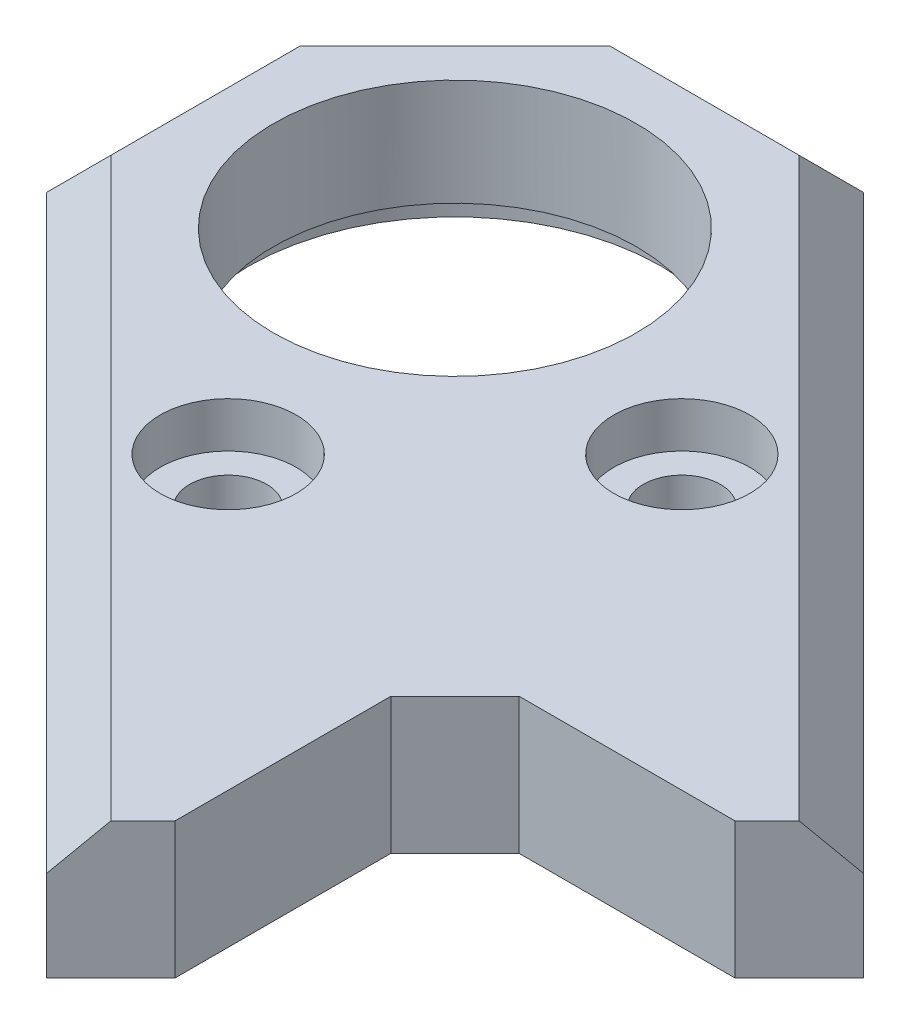
ISO-10303-21;
HEADER;
FILE_DESCRIPTION(('STEP AP214'),'2;1');
FILE_NAME('part.step','',(''),(''),'','','');
FILE_SCHEMA(('AUTOMOTIVE_DESIGN { 1 0 10303 214 1 1 1 1 }'));
ENDSEC;
DATA;
#1=APPLICATION_CONTEXT('core data for automotive mechanical design processes');
#2=APPLICATION_PROTOCOL_DEFINITION('international standard','automotive_design',2000,#1);
#3=PRODUCT_CONTEXT('',#1,'mechanical');
#4=PRODUCT('Part','Part','',(#3));
#5=PRODUCT_RELATED_PRODUCT_CATEGORY('part','',(#4));
#6=PRODUCT_DEFINITION_FORMATION('','',#4);
#7=PRODUCT_DEFINITION_CONTEXT('part definition',#1,'design');
#8=PRODUCT_DEFINITION('design','',#6,#7);
#9=PRODUCT_DEFINITION_SHAPE('','',#8);
#10=(LENGTH_UNIT() NAMED_UNIT(*) SI_UNIT(.MILLI.,.METRE.));
#11=(NAMED_UNIT(*) PLANE_ANGLE_UNIT() SI_UNIT($,.RADIAN.));
#12=(NAMED_UNIT(*) SI_UNIT($,.STERADIAN.) SOLID_ANGLE_UNIT());
#13=UNCERTAINTY_MEASURE_WITH_UNIT(LENGTH_MEASURE(1.E-05),#10,'distance_accuracy_value','');
#14=(GEOMETRIC_REPRESENTATION_CONTEXT(3) GLOBAL_UNCERTAINTY_ASSIGNED_CONTEXT((#13)) GLOBAL_UNIT_ASSIGNED_CONTEXT((#10,
#11,#12)) REPRESENTATION_CONTEXT('',''));
#15=CARTESIAN_POINT('',(0.,0.,0.));
#16=DIRECTION('',(0.,0.,1.));
#17=DIRECTION('',(1.,0.,0.));
#18=AXIS2_PLACEMENT_3D('',#15,#16,#17);
#19=CARTESIAN_POINT('',(-6.,0.,4.));
#20=DIRECTION('',(0.,1.,0.));
#21=DIRECTION('',(0.,0.,1.));
#22=AXIS2_PLACEMENT_3D('',#19,#20,#21);
#23=CYLINDRICAL_SURFACE('',#22,1.7);
#24=CARTESIAN_POINT('',(-6.,0.,4.));
#25=DIRECTION('',(0.,1.,0.));
#26=DIRECTION('',(0.,0.,1.));
#27=AXIS2_PLACEMENT_3D('',#24,#25,#26);
#28=CIRCLE('',#27,1.7);
#29=CARTESIAN_POINT('',(-6.,0.,5.7));
#30=VERTEX_POINT('',#29);
#31=EDGE_CURVE('E187',#30,#30,#28,.T.);
#32=ORIENTED_EDGE('',*,*,#31,.F.);
#33=EDGE_LOOP('',(#32));
#34=FACE_BOUND('',#33,.T.);
#35=CARTESIAN_POINT('',(-6.,4.,4.));
#36=DIRECTION('',(0.,1.,0.));
#37=DIRECTION('',(0.,0.,1.));
#38=AXIS2_PLACEMENT_3D('',#35,#36,#37);
#39=CIRCLE('',#38,1.7);
#40=CARTESIAN_POINT('',(-6.,4.,5.7));
#41=VERTEX_POINT('',#40);
#42=EDGE_CURVE('E183',#41,#41,#39,.F.);
#43=ORIENTED_EDGE('',*,*,#42,.F.);
#44=EDGE_LOOP('',(#43));
#45=FACE_BOUND('',#44,.T.);
#46=ADVANCED_FACE('F41',(#34,#45),#23,.F.);
#47=CARTESIAN_POINT('',(4.,0.,-6.));
#48=DIRECTION('',(0.,1.,0.));
#49=DIRECTION('',(0.,0.,1.));
#50=AXIS2_PLACEMENT_3D('',#47,#48,#49);
#51=CYLINDRICAL_SURFACE('',#50,1.7);
#52=CARTESIAN_POINT('',(4.,0.,-6.));
#53=DIRECTION('',(0.,1.,0.));
#54=DIRECTION('',(0.,0.,1.));
#55=AXIS2_PLACEMENT_3D('',#52,#53,#54);
#56=CIRCLE('',#55,1.7);
#57=CARTESIAN_POINT('',(4.,0.,-4.3));
#58=VERTEX_POINT('',#57);
#59=EDGE_CURVE('E235',#58,#58,#56,.T.);
#60=ORIENTED_EDGE('',*,*,#59,.F.);
#61=EDGE_LOOP('',(#60));
#62=FACE_BOUND('',#61,.T.);
#63=CARTESIAN_POINT('',(4.,4.,-6.));
#64=DIRECTION('',(0.,1.,0.));
#65=DIRECTION('',(0.,0.,1.));
#66=AXIS2_PLACEMENT_3D('',#63,#64,#65);
#67=CIRCLE('',#66,1.7);
#68=CARTESIAN_POINT('',(4.,4.,-4.3));
#69=VERTEX_POINT('',#68);
#70=EDGE_CURVE('E180',#69,#69,#67,.F.);
#71=ORIENTED_EDGE('',*,*,#70,.F.);
#72=EDGE_LOOP('',(#71));
#73=FACE_BOUND('',#72,.T.);
#74=ADVANCED_FACE('F303',(#62,#73),#51,.F.);
#75=CARTESIAN_POINT('',(22.,6.,4.00000000000001));
#76=DIRECTION('',(-0.707106781186546,0.,-0.707106781186549));
#77=DIRECTION('',(0.,-1.,0.));
#78=AXIS2_PLACEMENT_3D('',#75,#76,#77);
#79=PLANE('',#78);
#80=DIRECTION('',(-0.707106781186549,0.,0.707106781186546));
#81=VECTOR('',#80,1.);
#82=CARTESIAN_POINT('',(13.,6.,13.));
#83=LINE('',#82,#81);
#84=CARTESIAN_POINT('',(5.41421356237307,6.,20.5857864376269));
#85=VERTEX_POINT('',#84);
#86=CARTESIAN_POINT('',(6.82842712474616,6.,19.1715728752538));
#87=VERTEX_POINT('',#86);
#88=EDGE_CURVE('E173',#85,#87,#83,.F.);
#89=ORIENTED_EDGE('',*,*,#88,.F.);
#90=DIRECTION('',(0.500000000000002,0.707106781186546,-0.5));
#91=VECTOR('',#90,1.);
#92=CARTESIAN_POINT('',(13.7071067811866,17.7279220613578,12.2928932188134));
#93=LINE('',#92,#91);
#94=CARTESIAN_POINT('',(3.99999999999995,4.00000000000001,22.));
#95=VERTEX_POINT('',#94);
#96=EDGE_CURVE('E11',#85,#95,#93,.F.);
#97=ORIENTED_EDGE('',*,*,#96,.T.);
#98=DIRECTION('',(0.,1.,0.));
#99=VECTOR('',#98,1.);
#100=CARTESIAN_POINT('',(3.99999999999995,6.,22.));
#101=LINE('',#100,#99);
#102=CARTESIAN_POINT('',(3.99999999999995,0.,22.));
#103=VERTEX_POINT('',#102);
#104=EDGE_CURVE('E170',#103,#95,#101,.T.);
#105=ORIENTED_EDGE('',*,*,#104,.F.);
#106=DIRECTION('',(0.707106781186549,0.,-0.707106781186546));
#107=VECTOR('',#106,1.);
#108=CARTESIAN_POINT('',(22.,0.,4.00000000000001));
#109=LINE('',#108,#107);
#110=CARTESIAN_POINT('',(6.82842712474616,0.,19.1715728752538));
#111=VERTEX_POINT('',#110);
#112=EDGE_CURVE('E152',#111,#103,#109,.F.);
#113=ORIENTED_EDGE('',*,*,#112,.F.);
#114=DIRECTION('',(0.,1.,0.));
#115=VECTOR('',#114,1.);
#116=CARTESIAN_POINT('',(6.82842712474616,0.,19.1715728752538));
#117=LINE('',#116,#115);
#118=EDGE_CURVE('E238',#111,#87,#117,.T.);
#119=ORIENTED_EDGE('',*,*,#118,.T.);
#120=EDGE_LOOP('',(#89,#97,#105,#113,#119));
#121=FACE_BOUND('',#120,.T.);
#122=ADVANCED_FACE('F309',(#121),#79,.F.);
#123=CARTESIAN_POINT('',(-9.6298339959391,0.,-9.62499999999999));
#124=DIRECTION('',(0.,1.,0.));
#125=DIRECTION('',(0.,0.,1.));
#126=AXIS2_PLACEMENT_3D('',#123,#124,#125);
#127=CYLINDRICAL_SURFACE('',#126,8.);
#128=CARTESIAN_POINT('',(-9.6298339959391,6.,-9.62499999999999));
#129=DIRECTION('',(0.,1.,0.));
#130=DIRECTION('',(0.,0.,1.));
#131=AXIS2_PLACEMENT_3D('',#128,#129,#130);
#132=CIRCLE('',#131,8.);
#133=CARTESIAN_POINT('',(-9.6298339959391,6.,-1.62499999999999));
#134=VERTEX_POINT('',#133);
#135=EDGE_CURVE('E163',#134,#134,#132,.T.);
#136=ORIENTED_EDGE('',*,*,#135,.T.);
#137=EDGE_LOOP('',(#136));
#138=FACE_BOUND('',#137,.T.);
#139=CARTESIAN_POINT('',(-9.6298339959391,1.3,-9.62499999999999));
#140=DIRECTION('',(0.,-1.,0.));
#141=DIRECTION('',(0.,0.,-1.));
#142=AXIS2_PLACEMENT_3D('',#139,#140,#141);
#143=CIRCLE('',#142,8.);
#144=CARTESIAN_POINT('',(-9.6298339959391,1.3,-17.625));
#145=VERTEX_POINT('',#144);
#146=EDGE_CURVE('E176',#145,#145,#143,.F.);
#147=ORIENTED_EDGE('',*,*,#146,.F.);
#148=EDGE_LOOP('',(#147));
#149=FACE_BOUND('',#148,.T.);
#150=ADVANCED_FACE('F283',(#138,#149),#127,.F.);
#151=CARTESIAN_POINT('',(-22.,6.,-22.));
#152=DIRECTION('',(0.,0.,1.));
#153=DIRECTION('',(1.,0.,0.));
#154=AXIS2_PLACEMENT_3D('',#151,#152,#153);
#155=PLANE('',#154);
#156=DIRECTION('',(0.,1.,0.));
#157=VECTOR('',#156,1.);
#158=CARTESIAN_POINT('',(-14.,0.,-22.));
#159=LINE('',#158,#157);
#160=CARTESIAN_POINT('',(-14.,0.,-22.));
#161=VERTEX_POINT('',#160);
#162=CARTESIAN_POINT('',(-14.,4.00000000000001,-22.));
#163=VERTEX_POINT('',#162);
#164=EDGE_CURVE('E272',#161,#163,#159,.T.);
#165=ORIENTED_EDGE('',*,*,#164,.T.);
#166=DIRECTION('',(1.,0.,0.));
#167=VECTOR('',#166,1.);
#168=CARTESIAN_POINT('',(-4.,4.00000000000001,-22.));
#169=LINE('',#168,#167);
#170=CARTESIAN_POINT('',(-4.,4.00000000000001,-22.));
#171=VERTEX_POINT('',#170);
#172=EDGE_CURVE('E202',#163,#171,#169,.T.);
#173=ORIENTED_EDGE('',*,*,#172,.T.);
#174=DIRECTION('',(0.,1.,0.));
#175=VECTOR('',#174,1.);
#176=CARTESIAN_POINT('',(-4.,0.,-22.));
#177=LINE('',#176,#175);
#178=CARTESIAN_POINT('',(-4.,0.,-22.));
#179=VERTEX_POINT('',#178);
#180=EDGE_CURVE('E267',#179,#171,#177,.T.);
#181=ORIENTED_EDGE('',*,*,#180,.F.);
#182=DIRECTION('',(-1.,0.,0.));
#183=VECTOR('',#182,1.);
#184=CARTESIAN_POINT('',(-22.,0.,-22.));
#185=LINE('',#184,#183);
#186=EDGE_CURVE('E160',#179,#161,#185,.T.);
#187=ORIENTED_EDGE('',*,*,#186,.T.);
#188=EDGE_LOOP('',(#165,#173,#181,#187));
#189=FACE_BOUND('',#188,.T.);
#190=ADVANCED_FACE('F297',(#189),#155,.F.);
#191=CARTESIAN_POINT('',(-22.,6.,-22.));
#192=DIRECTION('',(1.,0.,0.));
#193=DIRECTION('',(0.,0.,-1.));
#194=AXIS2_PLACEMENT_3D('',#191,#192,#193);
#195=PLANE('',#194);
#196=DIRECTION('',(0.,1.,0.));
#197=VECTOR('',#196,1.);
#198=CARTESIAN_POINT('',(-22.,0.,-4.));
#199=LINE('',#198,#197);
#200=CARTESIAN_POINT('',(-22.,0.,-4.));
#201=VERTEX_POINT('',#200);
#202=CARTESIAN_POINT('',(-22.,4.00000000000001,-4.));
#203=VERTEX_POINT('',#202);
#204=EDGE_CURVE('E135',#201,#203,#199,.T.);
#205=ORIENTED_EDGE('',*,*,#204,.T.);
#206=DIRECTION('',(0.,0.,-1.));
#207=VECTOR('',#206,1.);
#208=CARTESIAN_POINT('',(-22.,4.00000000000001,-14.));
#209=LINE('',#208,#207);
#210=CARTESIAN_POINT('',(-22.,4.00000000000001,-14.));
#211=VERTEX_POINT('',#210);
#212=EDGE_CURVE('E206',#203,#211,#209,.T.);
#213=ORIENTED_EDGE('',*,*,#212,.T.);
#214=DIRECTION('',(0.,1.,0.));
#215=VECTOR('',#214,1.);
#216=CARTESIAN_POINT('',(-22.,0.,-14.));
#217=LINE('',#216,#215);
#218=CARTESIAN_POINT('',(-22.,0.,-14.));
#219=VERTEX_POINT('',#218);
#220=EDGE_CURVE('E158',#219,#211,#217,.T.);
#221=ORIENTED_EDGE('',*,*,#220,.F.);
#222=DIRECTION('',(0.,0.,1.));
#223=VECTOR('',#222,1.);
#224=CARTESIAN_POINT('',(-22.,0.,-22.));
#225=LINE('',#224,#223);
#226=EDGE_CURVE('E149',#219,#201,#225,.T.);
#227=ORIENTED_EDGE('',*,*,#226,.T.);
#228=EDGE_LOOP('',(#205,#213,#221,#227));
#229=FACE_BOUND('',#228,.T.);
#230=ADVANCED_FACE('F156',(#229),#195,.F.);
#231=CARTESIAN_POINT('',(0.,6.,0.));
#232=DIRECTION('',(0.,1.,0.));
#233=DIRECTION('',(0.,0.,1.));
#234=AXIS2_PLACEMENT_3D('',#231,#232,#233);
#235=PLANE('',#234);
#236=CARTESIAN_POINT('',(4.,6.,-6.));
#237=DIRECTION('',(0.,1.,0.));
#238=DIRECTION('',(0.,0.,1.));
#239=AXIS2_PLACEMENT_3D('',#236,#237,#238);
#240=CIRCLE('',#239,3.);
#241=CARTESIAN_POINT('',(4.,6.,-3.));
#242=VERTEX_POINT('',#241);
#243=EDGE_CURVE('E231',#242,#242,#240,.T.);
#244=ORIENTED_EDGE('',*,*,#243,.F.);
#245=EDGE_LOOP('',(#244));
#246=FACE_BOUND('',#245,.T.);
#247=CARTESIAN_POINT('',(-6.,6.,4.));
#248=DIRECTION('',(0.,1.,0.));
#249=DIRECTION('',(0.,0.,1.));
#250=AXIS2_PLACEMENT_3D('',#247,#248,#249);
#251=CIRCLE('',#250,3.);
#252=CARTESIAN_POINT('',(-6.,6.,7.));
#253=VERTEX_POINT('',#252);
#254=EDGE_CURVE('E226',#253,#253,#251,.T.);
#255=ORIENTED_EDGE('',*,*,#254,.F.);
#256=EDGE_LOOP('',(#255));
#257=FACE_BOUND('',#256,.T.);
#258=CARTESIAN_POINT('',(19.1715728752538,6.,6.82842712474616));
#259=VERTEX_POINT('',#258);
#260=CARTESIAN_POINT('',(20.5857864376269,6.,5.4142135623731));
#261=VERTEX_POINT('',#260);
#262=EDGE_CURVE('E172',#259,#261,#83,.F.);
#263=ORIENTED_EDGE('',*,*,#262,.T.);
#264=DIRECTION('',(-0.707106781186548,0.,-0.707106781186548));
#265=VECTOR('',#264,1.);
#266=CARTESIAN_POINT('',(-5.4142135623731,6.,-20.5857864376269));
#267=LINE('',#266,#265);
#268=CARTESIAN_POINT('',(-4.82842712474619,6.,-20.));
#269=VERTEX_POINT('',#268);
#270=EDGE_CURVE('E200',#261,#269,#267,.T.);
#271=ORIENTED_EDGE('',*,*,#270,.T.);
#272=DIRECTION('',(-1.,0.,0.));
#273=VECTOR('',#272,1.);
#274=CARTESIAN_POINT('',(-14.,6.,-20.));
#275=LINE('',#274,#273);
#276=CARTESIAN_POINT('',(-13.1715728752538,6.,-20.));
#277=VERTEX_POINT('',#276);
#278=EDGE_CURVE('E198',#269,#277,#275,.T.);
#279=ORIENTED_EDGE('',*,*,#278,.T.);
#280=DIRECTION('',(-0.707106781186548,0.,0.707106781186548));
#281=VECTOR('',#280,1.);
#282=CARTESIAN_POINT('',(-20.5857864376269,6.,-12.5857864376269));
#283=LINE('',#282,#281);
#284=CARTESIAN_POINT('',(-20.,6.,-13.1715728752538));
#285=VERTEX_POINT('',#284);
#286=EDGE_CURVE('E196',#277,#285,#283,.T.);
#287=ORIENTED_EDGE('',*,*,#286,.T.);
#288=DIRECTION('',(0.,0.,1.));
#289=VECTOR('',#288,1.);
#290=CARTESIAN_POINT('',(-20.,6.,-4.));
#291=LINE('',#290,#289);
#292=CARTESIAN_POINT('',(-20.,6.,-4.82842712474619));
#293=VERTEX_POINT('',#292);
#294=EDGE_CURVE('E194',#285,#293,#291,.T.);
#295=ORIENTED_EDGE('',*,*,#294,.T.);
#296=DIRECTION('',(0.707106781186548,0.,0.707106781186547));
#297=VECTOR('',#296,1.);
#298=CARTESIAN_POINT('',(5.4142135623731,6.,20.5857864376269));
#299=LINE('',#298,#297);
#300=EDGE_CURVE('E192',#293,#85,#299,.T.);
#301=ORIENTED_EDGE('',*,*,#300,.T.);
#302=ORIENTED_EDGE('',*,*,#88,.T.);
#303=DIRECTION('',(0.,0.,1.));
#304=VECTOR('',#303,1.);
#305=CARTESIAN_POINT('',(6.82842712474616,6.,9.65685424949236));
#306=LINE('',#305,#304);
#307=CARTESIAN_POINT('',(6.82842712474616,6.,9.65685424949236));
#308=VERTEX_POINT('',#307);
#309=EDGE_CURVE('E250',#308,#87,#306,.T.);
#310=ORIENTED_EDGE('',*,*,#309,.F.);
#311=DIRECTION('',(-0.707106781186548,0.,0.707106781186547));
#312=VECTOR('',#311,1.);
#313=CARTESIAN_POINT('',(9.65685424949236,6.,6.82842712474617));
#314=LINE('',#313,#312);
#315=CARTESIAN_POINT('',(9.65685424949236,6.,6.82842712474617));
#316=VERTEX_POINT('',#315);
#317=EDGE_CURVE('E253',#316,#308,#314,.T.);
#318=ORIENTED_EDGE('',*,*,#317,.F.);
#319=DIRECTION('',(-1.,0.,0.));
#320=VECTOR('',#319,1.);
#321=CARTESIAN_POINT('',(19.1715728752538,6.,6.82842712474616));
#322=LINE('',#321,#320);
#323=EDGE_CURVE('E143',#259,#316,#322,.T.);
#324=ORIENTED_EDGE('',*,*,#323,.F.);
#325=EDGE_LOOP('',(#263,#271,#279,#287,#295,#301,#302,#310,#318,#324));
#326=FACE_BOUND('',#325,.T.);
#327=ORIENTED_EDGE('',*,*,#135,.F.);
#328=EDGE_LOOP('',(#327));
#329=FACE_BOUND('',#328,.T.);
#330=ADVANCED_FACE('F286',(#246,#257,#326,#329),#235,.T.);
#331=CARTESIAN_POINT('',(0.,0.,0.));
#332=DIRECTION('',(0.,1.,0.));
#333=DIRECTION('',(0.,0.,1.));
#334=AXIS2_PLACEMENT_3D('',#331,#332,#333);
#335=PLANE('',#334);
#336=ORIENTED_EDGE('',*,*,#59,.T.);
#337=EDGE_LOOP('',(#336));
#338=FACE_BOUND('',#337,.T.);
#339=ORIENTED_EDGE('',*,*,#31,.T.);
#340=EDGE_LOOP('',(#339));
#341=FACE_BOUND('',#340,.T.);
#342=CARTESIAN_POINT('',(-9.6298339959391,0.,-9.62499999999999));
#343=DIRECTION('',(0.,-1.,0.));
#344=DIRECTION('',(0.,0.,-1.));
#345=AXIS2_PLACEMENT_3D('',#342,#343,#344);
#346=CIRCLE('',#345,9.1);
#347=CARTESIAN_POINT('',(-9.6298339959391,0.,-18.725));
#348=VERTEX_POINT('',#347);
#349=EDGE_CURVE('E275',#348,#348,#346,.T.);
#350=ORIENTED_EDGE('',*,*,#349,.F.);
#351=EDGE_LOOP('',(#350));
#352=FACE_BOUND('',#351,.T.);
#353=ORIENTED_EDGE('',*,*,#112,.T.);
#354=DIRECTION('',(-0.707106781186548,0.,-0.707106781186547));
#355=VECTOR('',#354,1.);
#356=CARTESIAN_POINT('',(-22.,0.,-4.));
#357=LINE('',#356,#355);
#358=EDGE_CURVE('E138',#103,#201,#357,.T.);
#359=ORIENTED_EDGE('',*,*,#358,.T.);
#360=ORIENTED_EDGE('',*,*,#226,.F.);
#361=DIRECTION('',(0.707106781186548,0.,-0.707106781186548));
#362=VECTOR('',#361,1.);
#363=CARTESIAN_POINT('',(-14.,0.,-22.));
#364=LINE('',#363,#362);
#365=EDGE_CURVE('E270',#219,#161,#364,.T.);
#366=ORIENTED_EDGE('',*,*,#365,.T.);
#367=ORIENTED_EDGE('',*,*,#186,.F.);
#368=DIRECTION('',(0.707106781186547,0.,0.707106781186547));
#369=VECTOR('',#368,1.);
#370=CARTESIAN_POINT('',(-4.,0.,-22.));
#371=LINE('',#370,#369);
#372=CARTESIAN_POINT('',(22.,0.,4.));
#373=VERTEX_POINT('',#372);
#374=EDGE_CURVE('E153',#179,#373,#371,.T.);
#375=ORIENTED_EDGE('',*,*,#374,.T.);
#376=CARTESIAN_POINT('',(19.1715728752538,0.,6.82842712474622));
#377=VERTEX_POINT('',#376);
#378=EDGE_CURVE('E167',#373,#377,#109,.F.);
#379=ORIENTED_EDGE('',*,*,#378,.T.);
#380=DIRECTION('',(-1.,0.,0.));
#381=VECTOR('',#380,1.);
#382=CARTESIAN_POINT('',(19.1715728752538,0.,6.82842712474616));
#383=LINE('',#382,#381);
#384=CARTESIAN_POINT('',(9.65685424949236,0.,6.82842712474617));
#385=VERTEX_POINT('',#384);
#386=EDGE_CURVE('E254',#377,#385,#383,.T.);
#387=ORIENTED_EDGE('',*,*,#386,.T.);
#388=DIRECTION('',(-0.707106781186548,0.,0.707106781186547));
#389=VECTOR('',#388,1.);
#390=CARTESIAN_POINT('',(9.65685424949236,0.,6.82842712474617));
#391=LINE('',#390,#389);
#392=CARTESIAN_POINT('',(6.82842712474616,0.,9.65685424949236));
#393=VERTEX_POINT('',#392);
#394=EDGE_CURVE('E260',#385,#393,#391,.T.);
#395=ORIENTED_EDGE('',*,*,#394,.T.);
#396=DIRECTION('',(0.,0.,1.));
#397=VECTOR('',#396,1.);
#398=CARTESIAN_POINT('',(6.82842712474616,0.,9.65685424949236));
#399=LINE('',#398,#397);
#400=EDGE_CURVE('E243',#393,#111,#399,.T.);
#401=ORIENTED_EDGE('',*,*,#400,.T.);
#402=EDGE_LOOP('',(#353,#359,#360,#366,#367,#375,#379,#387,#395,#401));
#403=FACE_BOUND('',#402,.T.);
#404=ADVANCED_FACE('F147',(#338,#341,#352,#403),#335,.F.);
#405=DIRECTION('',(0.,-1.,0.));
#406=VECTOR('',#405,1.);
#407=CARTESIAN_POINT('',(22.,6.,4.00000000000001));
#408=LINE('',#407,#406);
#409=CARTESIAN_POINT('',(22.,4.00000000000001,4.00000000000001));
#410=VERTEX_POINT('',#409);
#411=EDGE_CURVE('E159',#410,#373,#408,.T.);
#412=ORIENTED_EDGE('',*,*,#411,.F.);
#413=DIRECTION('',(0.500000000000002,-0.707106781186546,-0.5));
#414=VECTOR('',#413,1.);
#415=CARTESIAN_POINT('',(21.2928932188135,5.,4.70710678118655));
#416=LINE('',#415,#414);
#417=EDGE_CURVE('E190',#410,#261,#416,.F.);
#418=ORIENTED_EDGE('',*,*,#417,.T.);
#419=ORIENTED_EDGE('',*,*,#262,.F.);
#420=DIRECTION('',(0.,1.,0.));
#421=VECTOR('',#420,1.);
#422=CARTESIAN_POINT('',(19.1715728752538,0.,6.82842712474616));
#423=LINE('',#422,#421);
#424=EDGE_CURVE('E241',#377,#259,#423,.T.);
#425=ORIENTED_EDGE('',*,*,#424,.F.);
#426=ORIENTED_EDGE('',*,*,#378,.F.);
#427=EDGE_LOOP('',(#412,#418,#419,#425,#426));
#428=FACE_BOUND('',#427,.T.);
#429=ADVANCED_FACE('F294',(#428),#79,.F.);
#430=CARTESIAN_POINT('',(-9.6298339959391,1.3,-9.62499999999999));
#431=DIRECTION('',(0.,-1.,0.));
#432=DIRECTION('',(0.,0.,-1.));
#433=AXIS2_PLACEMENT_3D('',#430,#431,#432);
#434=PLANE('',#433);
#435=CARTESIAN_POINT('',(-9.6298339959391,1.3,-9.62499999999999));
#436=DIRECTION('',(0.,-1.,0.));
#437=DIRECTION('',(0.,0.,-1.));
#438=AXIS2_PLACEMENT_3D('',#435,#436,#437);
#439=CIRCLE('',#438,9.1);
#440=CARTESIAN_POINT('',(-9.6298339959391,1.3,-18.725));
#441=VERTEX_POINT('',#440);
#442=EDGE_CURVE('E179',#441,#441,#439,.T.);
#443=ORIENTED_EDGE('',*,*,#442,.T.);
#444=EDGE_LOOP('',(#443));
#445=FACE_BOUND('',#444,.T.);
#446=ORIENTED_EDGE('',*,*,#146,.T.);
#447=EDGE_LOOP('',(#446));
#448=FACE_BOUND('',#447,.T.);
#449=ADVANCED_FACE('F340',(#445,#448),#434,.T.);
#450=CARTESIAN_POINT('',(-9.6298339959391,1.3,-9.62499999999999));
#451=DIRECTION('',(0.,-1.,0.));
#452=DIRECTION('',(0.,0.,-1.));
#453=AXIS2_PLACEMENT_3D('',#450,#451,#452);
#454=CYLINDRICAL_SURFACE('',#453,9.1);
#455=ORIENTED_EDGE('',*,*,#442,.F.);
#456=EDGE_LOOP('',(#455));
#457=FACE_BOUND('',#456,.T.);
#458=ORIENTED_EDGE('',*,*,#349,.T.);
#459=EDGE_LOOP('',(#458));
#460=FACE_BOUND('',#459,.T.);
#461=ADVANCED_FACE('F338',(#457,#460),#454,.F.);
#462=CARTESIAN_POINT('',(-14.,0.,-22.));
#463=DIRECTION('',(0.707106781186547,0.,0.707106781186547));
#464=DIRECTION('',(0.707106781186548,0.,-0.707106781186548));
#465=AXIS2_PLACEMENT_3D('',#462,#463,#464);
#466=PLANE('',#465);
#467=ORIENTED_EDGE('',*,*,#220,.T.);
#468=DIRECTION('',(0.707106781186548,0.,-0.707106781186548));
#469=VECTOR('',#468,1.);
#470=CARTESIAN_POINT('',(-14.,4.00000000000001,-22.));
#471=LINE('',#470,#469);
#472=EDGE_CURVE('E204',#211,#163,#471,.T.);
#473=ORIENTED_EDGE('',*,*,#472,.T.);
#474=ORIENTED_EDGE('',*,*,#164,.F.);
#475=ORIENTED_EDGE('',*,*,#365,.F.);
#476=EDGE_LOOP('',(#467,#473,#474,#475));
#477=FACE_BOUND('',#476,.T.);
#478=ADVANCED_FACE('F334',(#477),#466,.F.);
#479=CARTESIAN_POINT('',(-4.,0.,-22.));
#480=DIRECTION('',(-0.707106781186548,0.,0.707106781186548));
#481=DIRECTION('',(0.707106781186548,0.,0.707106781186548));
#482=AXIS2_PLACEMENT_3D('',#479,#480,#481);
#483=PLANE('',#482);
#484=ORIENTED_EDGE('',*,*,#180,.T.);
#485=DIRECTION('',(0.707106781186548,0.,0.707106781186548));
#486=VECTOR('',#485,1.);
#487=CARTESIAN_POINT('',(22.,4.00000000000001,4.00000000000001));
#488=LINE('',#487,#486);
#489=EDGE_CURVE('E175',#171,#410,#488,.T.);
#490=ORIENTED_EDGE('',*,*,#489,.T.);
#491=ORIENTED_EDGE('',*,*,#411,.T.);
#492=ORIENTED_EDGE('',*,*,#374,.F.);
#493=EDGE_LOOP('',(#484,#490,#491,#492));
#494=FACE_BOUND('',#493,.T.);
#495=ADVANCED_FACE('F330',(#494),#483,.F.);
#496=CARTESIAN_POINT('',(6.82842712474616,0.,9.65685424949236));
#497=DIRECTION('',(-1.,0.,0.));
#498=DIRECTION('',(0.,0.,1.));
#499=AXIS2_PLACEMENT_3D('',#496,#497,#498);
#500=PLANE('',#499);
#501=ORIENTED_EDGE('',*,*,#309,.T.);
#502=ORIENTED_EDGE('',*,*,#118,.F.);
#503=ORIENTED_EDGE('',*,*,#400,.F.);
#504=DIRECTION('',(0.,1.,0.));
#505=VECTOR('',#504,1.);
#506=CARTESIAN_POINT('',(6.82842712474616,0.,9.65685424949236));
#507=LINE('',#506,#505);
#508=EDGE_CURVE('E246',#393,#308,#507,.T.);
#509=ORIENTED_EDGE('',*,*,#508,.T.);
#510=EDGE_LOOP('',(#501,#502,#503,#509));
#511=FACE_BOUND('',#510,.T.);
#512=ADVANCED_FACE('F326',(#511),#500,.F.);
#513=CARTESIAN_POINT('',(9.65685424949236,0.,6.82842712474617));
#514=DIRECTION('',(-0.707106781186547,0.,-0.707106781186548));
#515=DIRECTION('',(-0.707106781186548,0.,0.707106781186547));
#516=AXIS2_PLACEMENT_3D('',#513,#514,#515);
#517=PLANE('',#516);
#518=ORIENTED_EDGE('',*,*,#317,.T.);
#519=ORIENTED_EDGE('',*,*,#508,.F.);
#520=ORIENTED_EDGE('',*,*,#394,.F.);
#521=DIRECTION('',(0.,1.,0.));
#522=VECTOR('',#521,1.);
#523=CARTESIAN_POINT('',(9.65685424949236,0.,6.82842712474617));
#524=LINE('',#523,#522);
#525=EDGE_CURVE('E244',#385,#316,#524,.T.);
#526=ORIENTED_EDGE('',*,*,#525,.T.);
#527=EDGE_LOOP('',(#518,#519,#520,#526));
#528=FACE_BOUND('',#527,.T.);
#529=ADVANCED_FACE('F322',(#528),#517,.F.);
#530=CARTESIAN_POINT('',(19.1715728752538,0.,6.82842712474616));
#531=DIRECTION('',(0.,0.,-1.));
#532=DIRECTION('',(-1.,0.,0.));
#533=AXIS2_PLACEMENT_3D('',#530,#531,#532);
#534=PLANE('',#533);
#535=ORIENTED_EDGE('',*,*,#323,.T.);
#536=ORIENTED_EDGE('',*,*,#525,.F.);
#537=ORIENTED_EDGE('',*,*,#386,.F.);
#538=ORIENTED_EDGE('',*,*,#424,.T.);
#539=EDGE_LOOP('',(#535,#536,#537,#538));
#540=FACE_BOUND('',#539,.T.);
#541=ADVANCED_FACE('F319',(#540),#534,.F.);
#542=CARTESIAN_POINT('',(-22.,0.,-4.));
#543=DIRECTION('',(0.707106781186547,0.,-0.707106781186548));
#544=DIRECTION('',(-0.707106781186548,0.,-0.707106781186547));
#545=AXIS2_PLACEMENT_3D('',#542,#543,#544);
#546=PLANE('',#545);
#547=ORIENTED_EDGE('',*,*,#104,.T.);
#548=DIRECTION('',(-0.707106781186548,0.,-0.707106781186547));
#549=VECTOR('',#548,1.);
#550=CARTESIAN_POINT('',(-22.,4.00000000000001,-4.));
#551=LINE('',#550,#549);
#552=EDGE_CURVE('E51',#95,#203,#551,.T.);
#553=ORIENTED_EDGE('',*,*,#552,.T.);
#554=ORIENTED_EDGE('',*,*,#204,.F.);
#555=ORIENTED_EDGE('',*,*,#358,.F.);
#556=EDGE_LOOP('',(#547,#553,#554,#555));
#557=FACE_BOUND('',#556,.T.);
#558=ADVANCED_FACE('F137',(#557),#546,.F.);
#559=CARTESIAN_POINT('',(4.,4.,-6.));
#560=DIRECTION('',(0.,1.,0.));
#561=DIRECTION('',(0.,0.,1.));
#562=AXIS2_PLACEMENT_3D('',#559,#560,#561);
#563=PLANE('',#562);
#564=CARTESIAN_POINT('',(4.,4.,-6.));
#565=DIRECTION('',(0.,1.,0.));
#566=DIRECTION('',(0.,0.,1.));
#567=AXIS2_PLACEMENT_3D('',#564,#565,#566);
#568=CIRCLE('',#567,3.);
#569=CARTESIAN_POINT('',(4.,4.,-3.));
#570=VERTEX_POINT('',#569);
#571=EDGE_CURVE('E184',#570,#570,#568,.T.);
#572=ORIENTED_EDGE('',*,*,#571,.T.);
#573=EDGE_LOOP('',(#572));
#574=FACE_BOUND('',#573,.T.);
#575=ORIENTED_EDGE('',*,*,#70,.T.);
#576=EDGE_LOOP('',(#575));
#577=FACE_BOUND('',#576,.T.);
#578=ADVANCED_FACE('F318',(#574,#577),#563,.T.);
#579=CARTESIAN_POINT('',(4.,4.,-6.));
#580=DIRECTION('',(0.,1.,0.));
#581=DIRECTION('',(0.,0.,1.));
#582=AXIS2_PLACEMENT_3D('',#579,#580,#581);
#583=CYLINDRICAL_SURFACE('',#582,3.);
#584=ORIENTED_EDGE('',*,*,#571,.F.);
#585=EDGE_LOOP('',(#584));
#586=FACE_BOUND('',#585,.T.);
#587=ORIENTED_EDGE('',*,*,#243,.T.);
#588=EDGE_LOOP('',(#587));
#589=FACE_BOUND('',#588,.T.);
#590=ADVANCED_FACE('F511',(#586,#589),#583,.F.);
#591=CARTESIAN_POINT('',(-6.,4.,4.));
#592=DIRECTION('',(0.,1.,0.));
#593=DIRECTION('',(0.,0.,1.));
#594=AXIS2_PLACEMENT_3D('',#591,#592,#593);
#595=PLANE('',#594);
#596=CARTESIAN_POINT('',(-6.,4.,4.));
#597=DIRECTION('',(0.,1.,0.));
#598=DIRECTION('',(0.,0.,1.));
#599=AXIS2_PLACEMENT_3D('',#596,#597,#598);
#600=CIRCLE('',#599,3.);
#601=CARTESIAN_POINT('',(-6.,4.,7.));
#602=VERTEX_POINT('',#601);
#603=EDGE_CURVE('E221',#602,#602,#600,.T.);
#604=ORIENTED_EDGE('',*,*,#603,.T.);
#605=EDGE_LOOP('',(#604));
#606=FACE_BOUND('',#605,.T.);
#607=ORIENTED_EDGE('',*,*,#42,.T.);
#608=EDGE_LOOP('',(#607));
#609=FACE_BOUND('',#608,.T.);
#610=ADVANCED_FACE('F500',(#606,#609),#595,.T.);
#611=CARTESIAN_POINT('',(-6.,4.,4.));
#612=DIRECTION('',(0.,1.,0.));
#613=DIRECTION('',(0.,0.,1.));
#614=AXIS2_PLACEMENT_3D('',#611,#612,#613);
#615=CYLINDRICAL_SURFACE('',#614,3.);
#616=ORIENTED_EDGE('',*,*,#603,.F.);
#617=EDGE_LOOP('',(#616));
#618=FACE_BOUND('',#617,.T.);
#619=ORIENTED_EDGE('',*,*,#254,.T.);
#620=EDGE_LOOP('',(#619));
#621=FACE_BOUND('',#620,.T.);
#622=ADVANCED_FACE('F396',(#618,#621),#615,.F.);
#623=CARTESIAN_POINT('',(-22.,4.00000000000001,-4.));
#624=DIRECTION('',(-0.499999999999999,0.707106781186549,0.499999999999999));
#625=DIRECTION('',(0.707106781186548,0.,0.707106781186547));
#626=AXIS2_PLACEMENT_3D('',#623,#624,#625);
#627=PLANE('',#626);
#628=ORIENTED_EDGE('',*,*,#96,.F.);
#629=ORIENTED_EDGE('',*,*,#300,.F.);
#630=DIRECTION('',(-0.678598344545848,-0.678598344545846,0.281084637714821));
#631=VECTOR('',#630,1.);
#632=CARTESIAN_POINT('',(-22.,4.00000000000001,-4.));
#633=LINE('',#632,#631);
#634=EDGE_CURVE('E46',#203,#293,#633,.F.);
#635=ORIENTED_EDGE('',*,*,#634,.F.);
#636=ORIENTED_EDGE('',*,*,#552,.F.);
#637=EDGE_LOOP('',(#628,#629,#635,#636));
#638=FACE_BOUND('',#637,.T.);
#639=ADVANCED_FACE('F44',(#638),#627,.T.);
#640=CARTESIAN_POINT('',(-20.,6.,0.));
#641=DIRECTION('',(-0.707106781186546,0.707106781186549,0.));
#642=DIRECTION('',(0.,0.,-1.));
#643=AXIS2_PLACEMENT_3D('',#640,#641,#642);
#644=PLANE('',#643);
#645=ORIENTED_EDGE('',*,*,#634,.T.);
#646=ORIENTED_EDGE('',*,*,#294,.F.);
#647=DIRECTION('',(-0.678598344545848,-0.678598344545846,-0.281084637714821));
#648=VECTOR('',#647,1.);
#649=CARTESIAN_POINT('',(-17.4876071694909,8.5123928305091,-12.130905690848));
#650=LINE('',#649,#648);
#651=EDGE_CURVE('E214',#211,#285,#650,.F.);
#652=ORIENTED_EDGE('',*,*,#651,.F.);
#653=ORIENTED_EDGE('',*,*,#212,.F.);
#654=EDGE_LOOP('',(#645,#646,#652,#653));
#655=FACE_BOUND('',#654,.T.);
#656=ADVANCED_FACE('F389',(#655),#644,.T.);
#657=CARTESIAN_POINT('',(-14.,4.00000000000001,-22.));
#658=DIRECTION('',(-0.499999999999999,0.707106781186549,-0.499999999999999));
#659=DIRECTION('',(-0.707106781186548,0.,0.707106781186548));
#660=AXIS2_PLACEMENT_3D('',#657,#658,#659);
#661=PLANE('',#660);
#662=ORIENTED_EDGE('',*,*,#651,.T.);
#663=ORIENTED_EDGE('',*,*,#286,.F.);
#664=DIRECTION('',(-0.281084637714821,-0.678598344545846,-0.678598344545848));
#665=VECTOR('',#664,1.);
#666=CARTESIAN_POINT('',(-14.,4.00000000000001,-22.));
#667=LINE('',#666,#665);
#668=EDGE_CURVE('E212',#163,#277,#667,.F.);
#669=ORIENTED_EDGE('',*,*,#668,.F.);
#670=ORIENTED_EDGE('',*,*,#472,.F.);
#671=EDGE_LOOP('',(#662,#663,#669,#670));
#672=FACE_BOUND('',#671,.T.);
#673=ADVANCED_FACE('F372',(#672),#661,.T.);
#674=CARTESIAN_POINT('',(0.,6.,-20.));
#675=DIRECTION('',(0.,0.707106781186549,-0.707106781186546));
#676=DIRECTION('',(1.,0.,0.));
#677=AXIS2_PLACEMENT_3D('',#674,#675,#676);
#678=PLANE('',#677);
#679=ORIENTED_EDGE('',*,*,#668,.T.);
#680=ORIENTED_EDGE('',*,*,#278,.F.);
#681=DIRECTION('',(0.281084637714821,-0.678598344545846,-0.678598344545848));
#682=VECTOR('',#681,1.);
#683=CARTESIAN_POINT('',(-4.4469399850851,5.07900857355927,-20.9209914264407));
#684=LINE('',#683,#682);
#685=EDGE_CURVE('E209',#171,#269,#684,.F.);
#686=ORIENTED_EDGE('',*,*,#685,.F.);
#687=ORIENTED_EDGE('',*,*,#172,.F.);
#688=EDGE_LOOP('',(#679,#680,#686,#687));
#689=FACE_BOUND('',#688,.T.);
#690=ADVANCED_FACE('F377',(#689),#678,.T.);
#691=CARTESIAN_POINT('',(-4.,4.00000000000001,-22.));
#692=DIRECTION('',(0.499999999999999,0.707106781186549,-0.499999999999999));
#693=DIRECTION('',(-0.707106781186548,0.,-0.707106781186548));
#694=AXIS2_PLACEMENT_3D('',#691,#692,#693);
#695=PLANE('',#694);
#696=ORIENTED_EDGE('',*,*,#685,.T.);
#697=ORIENTED_EDGE('',*,*,#270,.F.);
#698=ORIENTED_EDGE('',*,*,#417,.F.);
#699=ORIENTED_EDGE('',*,*,#489,.F.);
#700=EDGE_LOOP('',(#696,#697,#698,#699));
#701=FACE_BOUND('',#700,.T.);
#702=ADVANCED_FACE('F380',(#701),#695,.T.);
#703=CLOSED_SHELL('',(#46,#74,#122,#150,#190,#230,#330,#404,#429,#449,#461,#478,#495,#512,#529,
#541,#558,#578,#590,#610,#622,#639,#656,#673,#690,#702));
#704=MANIFOLD_SOLID_BREP('B2',#703);
#705=ADVANCED_BREP_SHAPE_REPRESENTATION('',(#18,#704),#14);
#706=SHAPE_DEFINITION_REPRESENTATION(#9,#705);
ENDSEC;
END-ISO-10303-21;
